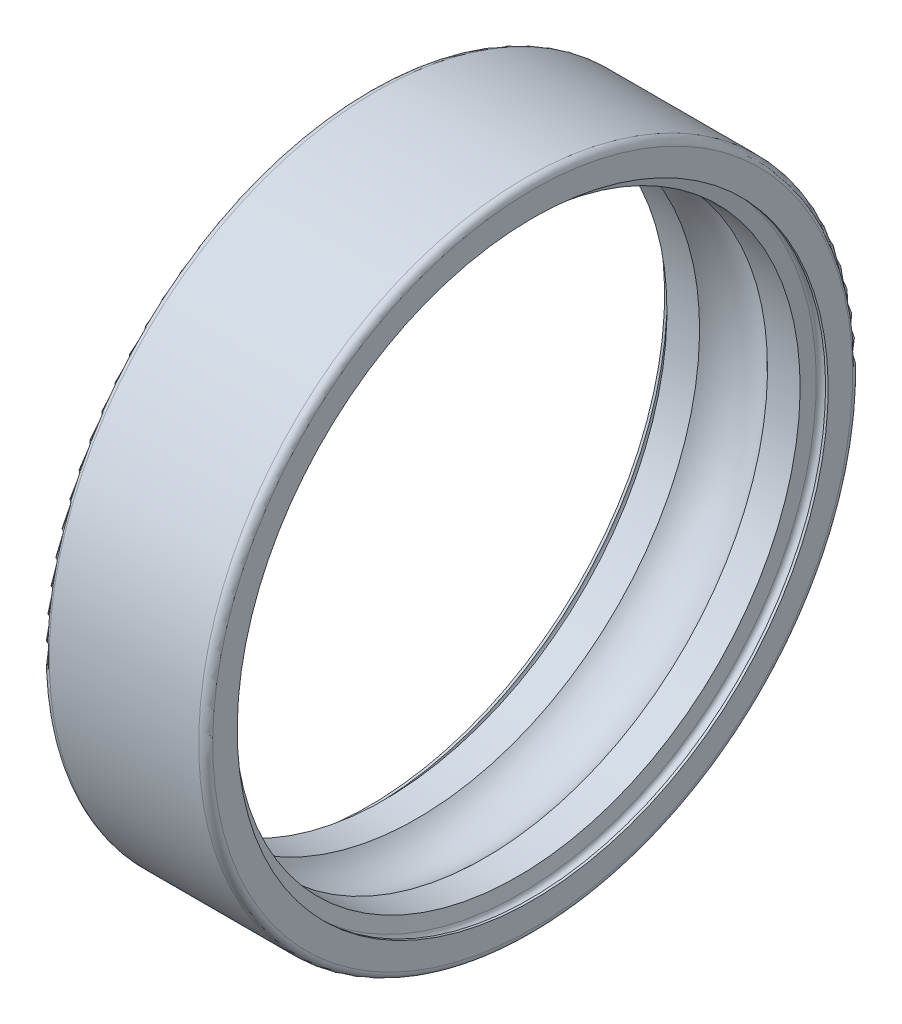
ISO-10303-21;
HEADER;
FILE_DESCRIPTION(('STEP AP214'),'2;1');
FILE_NAME('part.step','',(''),(''),'','','');
FILE_SCHEMA(('AUTOMOTIVE_DESIGN { 1 0 10303 214 1 1 1 1 }'));
ENDSEC;
DATA;
#1=APPLICATION_CONTEXT('core data for automotive mechanical design processes');
#2=APPLICATION_PROTOCOL_DEFINITION('international standard','automotive_design',2000,#1);
#3=PRODUCT_CONTEXT('',#1,'mechanical');
#4=PRODUCT('Part','Part','',(#3));
#5=PRODUCT_RELATED_PRODUCT_CATEGORY('part','',(#4));
#6=PRODUCT_DEFINITION_FORMATION('','',#4);
#7=PRODUCT_DEFINITION_CONTEXT('part definition',#1,'design');
#8=PRODUCT_DEFINITION('design','',#6,#7);
#9=PRODUCT_DEFINITION_SHAPE('','',#8);
#10=(LENGTH_UNIT() NAMED_UNIT(*) SI_UNIT(.MILLI.,.METRE.));
#11=(NAMED_UNIT(*) PLANE_ANGLE_UNIT() SI_UNIT($,.RADIAN.));
#12=(NAMED_UNIT(*) SI_UNIT($,.STERADIAN.) SOLID_ANGLE_UNIT());
#13=UNCERTAINTY_MEASURE_WITH_UNIT(LENGTH_MEASURE(1.E-05),#10,'distance_accuracy_value','');
#14=(GEOMETRIC_REPRESENTATION_CONTEXT(3) GLOBAL_UNCERTAINTY_ASSIGNED_CONTEXT((#13)) GLOBAL_UNIT_ASSIGNED_CONTEXT((#10,
#11,#12)) REPRESENTATION_CONTEXT('',''));
#15=CARTESIAN_POINT('',(0.,0.,0.));
#16=DIRECTION('',(0.,0.,1.));
#17=DIRECTION('',(1.,0.,0.));
#18=AXIS2_PLACEMENT_3D('',#15,#16,#17);
#19=CARTESIAN_POINT('',(6.67,0.,0.));
#20=DIRECTION('',(1.,0.,0.));
#21=DIRECTION('',(0.,0.,-1.));
#22=AXIS2_PLACEMENT_3D('',#19,#20,#21);
#23=TOROIDAL_SURFACE('',#22,12.65,0.22);
#24=CARTESIAN_POINT('',(6.89,0.,0.));
#25=DIRECTION('',(1.,0.,0.));
#26=DIRECTION('',(0.,1.,0.));
#27=AXIS2_PLACEMENT_3D('',#24,#25,#26);
#28=CIRCLE('',#27,12.65);
#29=CARTESIAN_POINT('',(6.89,12.65,0.));
#30=VERTEX_POINT('',#29);
#31=EDGE_CURVE('E11',#30,#30,#28,.T.);
#32=ORIENTED_EDGE('',*,*,#31,.T.);
#33=EDGE_LOOP('',(#32));
#34=FACE_BOUND('',#33,.T.);
#35=CARTESIAN_POINT('',(6.45334229433731,0.,0.));
#36=DIRECTION('',(1.,0.,0.));
#37=DIRECTION('',(0.,1.,0.));
#38=AXIS2_PLACEMENT_3D('',#35,#36,#37);
#39=CIRCLE('',#38,12.6882025990867);
#40=CARTESIAN_POINT('',(6.45334229433731,12.6882025990867,0.));
#41=VERTEX_POINT('',#40);
#42=EDGE_CURVE('E20',#41,#41,#39,.T.);
#43=ORIENTED_EDGE('',*,*,#42,.F.);
#44=EDGE_LOOP('',(#43));
#45=FACE_BOUND('',#44,.T.);
#46=ADVANCED_FACE('F16',(#34,#45),#23,.F.);
#47=CARTESIAN_POINT('',(6.945,0.,0.));
#48=DIRECTION('',(-1.,0.,0.));
#49=DIRECTION('',(0.,1.,0.));
#50=AXIS2_PLACEMENT_3D('',#47,#48,#49);
#51=CYLINDRICAL_SURFACE('',#50,12.65);
#52=CARTESIAN_POINT('',(7.,0.,0.));
#53=DIRECTION('',(1.,0.,0.));
#54=DIRECTION('',(0.,1.,0.));
#55=AXIS2_PLACEMENT_3D('',#52,#53,#54);
#56=CIRCLE('',#55,12.65);
#57=CARTESIAN_POINT('',(7.,12.65,0.));
#58=VERTEX_POINT('',#57);
#59=EDGE_CURVE('E25',#58,#58,#56,.T.);
#60=ORIENTED_EDGE('',*,*,#59,.T.);
#61=EDGE_LOOP('',(#60));
#62=FACE_BOUND('',#61,.T.);
#63=ORIENTED_EDGE('',*,*,#31,.F.);
#64=EDGE_LOOP('',(#63));
#65=FACE_BOUND('',#64,.T.);
#66=ADVANCED_FACE('F129',(#62,#65),#51,.F.);
#67=CARTESIAN_POINT('',(7.,13.175,0.));
#68=DIRECTION('',(1.,0.,0.));
#69=DIRECTION('',(0.,1.,0.));
#70=AXIS2_PLACEMENT_3D('',#67,#68,#69);
#71=PLANE('',#70);
#72=CARTESIAN_POINT('',(7.,0.,0.));
#73=DIRECTION('',(1.,0.,0.));
#74=DIRECTION('',(0.,1.,0.));
#75=AXIS2_PLACEMENT_3D('',#72,#73,#74);
#76=CIRCLE('',#75,13.7);
#77=CARTESIAN_POINT('',(7.,13.7,0.));
#78=VERTEX_POINT('',#77);
#79=EDGE_CURVE('E84',#78,#78,#76,.T.);
#80=ORIENTED_EDGE('',*,*,#79,.T.);
#81=EDGE_LOOP('',(#80));
#82=FACE_BOUND('',#81,.T.);
#83=ORIENTED_EDGE('',*,*,#59,.F.);
#84=EDGE_LOOP('',(#83));
#85=FACE_BOUND('',#84,.T.);
#86=ADVANCED_FACE('F134',(#82,#85),#71,.T.);
#87=CARTESIAN_POINT('',(6.7,0.,0.));
#88=DIRECTION('',(1.,0.,0.));
#89=DIRECTION('',(0.,0.,-1.));
#90=AXIS2_PLACEMENT_3D('',#87,#88,#89);
#91=TOROIDAL_SURFACE('',#90,13.7,0.3);
#92=CARTESIAN_POINT('',(6.7,0.,0.));
#93=DIRECTION('',(1.,0.,0.));
#94=DIRECTION('',(0.,1.,0.));
#95=AXIS2_PLACEMENT_3D('',#92,#93,#94);
#96=CIRCLE('',#95,14.);
#97=CARTESIAN_POINT('',(6.7,14.,0.));
#98=VERTEX_POINT('',#97);
#99=EDGE_CURVE('E82',#98,#98,#96,.T.);
#100=ORIENTED_EDGE('',*,*,#99,.T.);
#101=EDGE_LOOP('',(#100));
#102=FACE_BOUND('',#101,.T.);
#103=ORIENTED_EDGE('',*,*,#79,.F.);
#104=EDGE_LOOP('',(#103));
#105=FACE_BOUND('',#104,.T.);
#106=ADVANCED_FACE('F142',(#102,#105),#91,.T.);
#107=CARTESIAN_POINT('',(3.5,0.,0.));
#108=DIRECTION('',(-1.,0.,0.));
#109=DIRECTION('',(0.,1.,0.));
#110=AXIS2_PLACEMENT_3D('',#107,#108,#109);
#111=CYLINDRICAL_SURFACE('',#110,14.);
#112=CARTESIAN_POINT('',(0.3,0.,0.));
#113=DIRECTION('',(1.,0.,0.));
#114=DIRECTION('',(0.,1.,0.));
#115=AXIS2_PLACEMENT_3D('',#112,#113,#114);
#116=CIRCLE('',#115,14.);
#117=CARTESIAN_POINT('',(0.3,14.,0.));
#118=VERTEX_POINT('',#117);
#119=EDGE_CURVE('E81',#118,#118,#116,.T.);
#120=ORIENTED_EDGE('',*,*,#119,.T.);
#121=EDGE_LOOP('',(#120));
#122=FACE_BOUND('',#121,.T.);
#123=ORIENTED_EDGE('',*,*,#99,.F.);
#124=EDGE_LOOP('',(#123));
#125=FACE_BOUND('',#124,.T.);
#126=ADVANCED_FACE('F139',(#122,#125),#111,.T.);
#127=CARTESIAN_POINT('',(0.3,0.,0.));
#128=DIRECTION('',(1.,0.,0.));
#129=DIRECTION('',(0.,0.,-1.));
#130=AXIS2_PLACEMENT_3D('',#127,#128,#129);
#131=TOROIDAL_SURFACE('',#130,13.7,0.3);
#132=CARTESIAN_POINT('',(0.,0.,0.));
#133=DIRECTION('',(1.,0.,0.));
#134=DIRECTION('',(0.,1.,0.));
#135=AXIS2_PLACEMENT_3D('',#132,#133,#134);
#136=CIRCLE('',#135,13.7);
#137=CARTESIAN_POINT('',(0.,13.7,0.));
#138=VERTEX_POINT('',#137);
#139=EDGE_CURVE('E83',#138,#138,#136,.T.);
#140=ORIENTED_EDGE('',*,*,#139,.T.);
#141=EDGE_LOOP('',(#140));
#142=FACE_BOUND('',#141,.T.);
#143=ORIENTED_EDGE('',*,*,#119,.F.);
#144=EDGE_LOOP('',(#143));
#145=FACE_BOUND('',#144,.T.);
#146=ADVANCED_FACE('F124',(#142,#145),#131,.T.);
#147=CARTESIAN_POINT('',(0.,13.175,0.));
#148=DIRECTION('',(-1.,0.,0.));
#149=DIRECTION('',(0.,-1.,0.));
#150=AXIS2_PLACEMENT_3D('',#147,#148,#149);
#151=PLANE('',#150);
#152=CARTESIAN_POINT('',(0.,0.,0.));
#153=DIRECTION('',(1.,0.,0.));
#154=DIRECTION('',(0.,1.,0.));
#155=AXIS2_PLACEMENT_3D('',#152,#153,#154);
#156=CIRCLE('',#155,12.65);
#157=CARTESIAN_POINT('',(0.,12.65,0.));
#158=VERTEX_POINT('',#157);
#159=EDGE_CURVE('E93',#158,#158,#156,.T.);
#160=ORIENTED_EDGE('',*,*,#159,.T.);
#161=EDGE_LOOP('',(#160));
#162=FACE_BOUND('',#161,.T.);
#163=ORIENTED_EDGE('',*,*,#139,.F.);
#164=EDGE_LOOP('',(#163));
#165=FACE_BOUND('',#164,.T.);
#166=ADVANCED_FACE('F110',(#162,#165),#151,.T.);
#167=CARTESIAN_POINT('',(0.055,0.,0.));
#168=DIRECTION('',(-1.,0.,0.));
#169=DIRECTION('',(0.,1.,0.));
#170=AXIS2_PLACEMENT_3D('',#167,#168,#169);
#171=CYLINDRICAL_SURFACE('',#170,12.65);
#172=CARTESIAN_POINT('',(0.11,0.,0.));
#173=DIRECTION('',(1.,0.,0.));
#174=DIRECTION('',(0.,1.,0.));
#175=AXIS2_PLACEMENT_3D('',#172,#173,#174);
#176=CIRCLE('',#175,12.65);
#177=CARTESIAN_POINT('',(0.11,12.65,0.));
#178=VERTEX_POINT('',#177);
#179=EDGE_CURVE('E100',#178,#178,#176,.T.);
#180=ORIENTED_EDGE('',*,*,#179,.T.);
#181=EDGE_LOOP('',(#180));
#182=FACE_BOUND('',#181,.T.);
#183=ORIENTED_EDGE('',*,*,#159,.F.);
#184=EDGE_LOOP('',(#183));
#185=FACE_BOUND('',#184,.T.);
#186=ADVANCED_FACE('F113',(#182,#185),#171,.F.);
#187=CARTESIAN_POINT('',(0.33,0.,0.));
#188=DIRECTION('',(1.,0.,0.));
#189=DIRECTION('',(0.,0.,-1.));
#190=AXIS2_PLACEMENT_3D('',#187,#188,#189);
#191=TOROIDAL_SURFACE('',#190,12.65,0.22);
#192=CARTESIAN_POINT('',(0.546657705662686,0.,0.));
#193=DIRECTION('',(1.,0.,0.));
#194=DIRECTION('',(0.,1.,0.));
#195=AXIS2_PLACEMENT_3D('',#192,#193,#194);
#196=CIRCLE('',#195,12.6882025990867);
#197=CARTESIAN_POINT('',(0.546657705662686,12.6882025990867,0.));
#198=VERTEX_POINT('',#197);
#199=EDGE_CURVE('E97',#198,#198,#196,.T.);
#200=ORIENTED_EDGE('',*,*,#199,.T.);
#201=EDGE_LOOP('',(#200));
#202=FACE_BOUND('',#201,.T.);
#203=ORIENTED_EDGE('',*,*,#179,.F.);
#204=EDGE_LOOP('',(#203));
#205=FACE_BOUND('',#204,.T.);
#206=ADVANCED_FACE('F18',(#202,#205),#191,.F.);
#207=CARTESIAN_POINT('',(0.598515699833603,0.,0.));
#208=DIRECTION('',(-1.,0.,0.));
#209=DIRECTION('',(0.,1.,0.));
#210=AXIS2_PLACEMENT_3D('',#207,#208,#209);
#211=CONICAL_SURFACE('',#210,12.3941012995434,1.39626340159546);
#212=CARTESIAN_POINT('',(0.650373694004521,0.,0.));
#213=DIRECTION('',(1.,0.,0.));
#214=DIRECTION('',(0.,1.,0.));
#215=AXIS2_PLACEMENT_3D('',#212,#213,#214);
#216=CIRCLE('',#215,12.1);
#217=CARTESIAN_POINT('',(0.65037369400452,12.1,0.));
#218=VERTEX_POINT('',#217);
#219=EDGE_CURVE('E96',#218,#218,#216,.T.);
#220=ORIENTED_EDGE('',*,*,#219,.T.);
#221=EDGE_LOOP('',(#220));
#222=FACE_BOUND('',#221,.T.);
#223=ORIENTED_EDGE('',*,*,#199,.F.);
#224=EDGE_LOOP('',(#223));
#225=FACE_BOUND('',#224,.T.);
#226=ADVANCED_FACE('F122',(#222,#225),#211,.F.);
#227=CARTESIAN_POINT('',(1.34790762792612,0.,0.));
#228=DIRECTION('',(-1.,0.,0.));
#229=DIRECTION('',(0.,1.,0.));
#230=AXIS2_PLACEMENT_3D('',#227,#228,#229);
#231=CYLINDRICAL_SURFACE('',#230,12.1);
#232=CARTESIAN_POINT('',(2.04544156184773,0.,0.));
#233=DIRECTION('',(1.,0.,0.));
#234=DIRECTION('',(0.,1.,0.));
#235=AXIS2_PLACEMENT_3D('',#232,#233,#234);
#236=CIRCLE('',#235,12.1);
#237=CARTESIAN_POINT('',(2.04544156184773,12.1,0.));
#238=VERTEX_POINT('',#237);
#239=EDGE_CURVE('E95',#238,#238,#236,.T.);
#240=ORIENTED_EDGE('',*,*,#239,.T.);
#241=EDGE_LOOP('',(#240));
#242=FACE_BOUND('',#241,.T.);
#243=ORIENTED_EDGE('',*,*,#219,.F.);
#244=EDGE_LOOP('',(#243));
#245=FACE_BOUND('',#244,.T.);
#246=ADVANCED_FACE('F152',(#242,#245),#231,.F.);
#247=CARTESIAN_POINT('',(3.5,0.,0.));
#248=DIRECTION('',(1.,0.,0.));
#249=DIRECTION('',(0.,0.,-1.));
#250=AXIS2_PLACEMENT_3D('',#247,#248,#249);
#251=TOROIDAL_SURFACE('',#250,10.75,1.9845);
#252=CARTESIAN_POINT('',(4.95455843815228,0.,0.));
#253=DIRECTION('',(1.,0.,0.));
#254=DIRECTION('',(0.,1.,0.));
#255=AXIS2_PLACEMENT_3D('',#252,#253,#254);
#256=CIRCLE('',#255,12.1);
#257=CARTESIAN_POINT('',(4.95455843815228,12.1,0.));
#258=VERTEX_POINT('',#257);
#259=EDGE_CURVE('E78',#258,#258,#256,.T.);
#260=ORIENTED_EDGE('',*,*,#259,.T.);
#261=EDGE_LOOP('',(#260));
#262=FACE_BOUND('',#261,.T.);
#263=ORIENTED_EDGE('',*,*,#239,.F.);
#264=EDGE_LOOP('',(#263));
#265=FACE_BOUND('',#264,.T.);
#266=ADVANCED_FACE('F150',(#262,#265),#251,.F.);
#267=CARTESIAN_POINT('',(5.65209237207388,0.,0.));
#268=DIRECTION('',(-1.,0.,0.));
#269=DIRECTION('',(0.,1.,0.));
#270=AXIS2_PLACEMENT_3D('',#267,#268,#269);
#271=CYLINDRICAL_SURFACE('',#270,12.1);
#272=CARTESIAN_POINT('',(6.34962630599548,0.,0.));
#273=DIRECTION('',(1.,0.,0.));
#274=DIRECTION('',(0.,1.,0.));
#275=AXIS2_PLACEMENT_3D('',#272,#273,#274);
#276=CIRCLE('',#275,12.1);
#277=CARTESIAN_POINT('',(6.34962630599548,12.1,0.));
#278=VERTEX_POINT('',#277);
#279=EDGE_CURVE('E73',#278,#278,#276,.T.);
#280=ORIENTED_EDGE('',*,*,#279,.T.);
#281=EDGE_LOOP('',(#280));
#282=FACE_BOUND('',#281,.T.);
#283=ORIENTED_EDGE('',*,*,#259,.F.);
#284=EDGE_LOOP('',(#283));
#285=FACE_BOUND('',#284,.T.);
#286=ADVANCED_FACE('F74',(#282,#285),#271,.F.);
#287=CARTESIAN_POINT('',(6.4014843001664,0.,0.));
#288=DIRECTION('',(1.,0.,0.));
#289=DIRECTION('',(0.,1.,0.));
#290=AXIS2_PLACEMENT_3D('',#287,#288,#289);
#291=CONICAL_SURFACE('',#290,12.3941012995434,1.39626340159547);
#292=ORIENTED_EDGE('',*,*,#42,.T.);
#293=EDGE_LOOP('',(#292));
#294=FACE_BOUND('',#293,.T.);
#295=ORIENTED_EDGE('',*,*,#279,.F.);
#296=EDGE_LOOP('',(#295));
#297=FACE_BOUND('',#296,.T.);
#298=ADVANCED_FACE('F146',(#294,#297),#291,.F.);
#299=CLOSED_SHELL('',(#46,#66,#86,#106,#126,#146,#166,#186,#206,#226,#246,#266,#286,#298));
#300=MANIFOLD_SOLID_BREP('B1',#299);
#301=ADVANCED_BREP_SHAPE_REPRESENTATION('',(#18,#300),#14);
#302=SHAPE_DEFINITION_REPRESENTATION(#9,#301);
ENDSEC;
END-ISO-10303-21;
